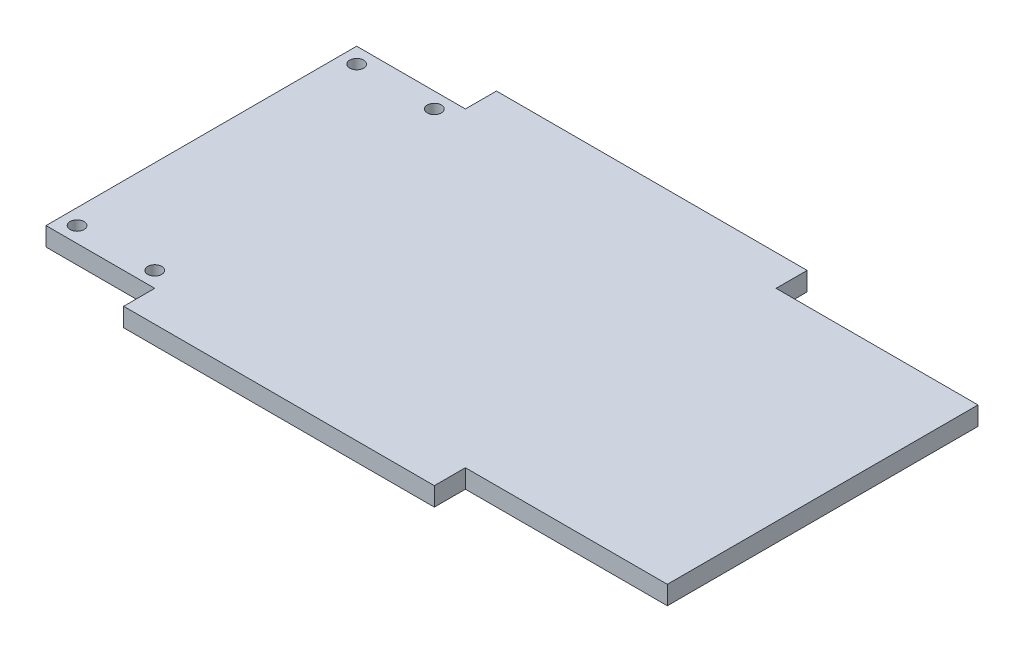
ISO-10303-21;
HEADER;
FILE_DESCRIPTION(('STEP AP214'),'2;1');
FILE_NAME('part.step','',(''),(''),'','','');
FILE_SCHEMA(('AUTOMOTIVE_DESIGN { 1 0 10303 214 1 1 1 1 }'));
ENDSEC;
DATA;
#1=APPLICATION_CONTEXT('core data for automotive mechanical design processes');
#2=APPLICATION_PROTOCOL_DEFINITION('international standard','automotive_design',2000,#1);
#3=PRODUCT_CONTEXT('',#1,'mechanical');
#4=PRODUCT('Part','Part','',(#3));
#5=PRODUCT_RELATED_PRODUCT_CATEGORY('part','',(#4));
#6=PRODUCT_DEFINITION_FORMATION('','',#4);
#7=PRODUCT_DEFINITION_CONTEXT('part definition',#1,'design');
#8=PRODUCT_DEFINITION('design','',#6,#7);
#9=PRODUCT_DEFINITION_SHAPE('','',#8);
#10=(LENGTH_UNIT() NAMED_UNIT(*) SI_UNIT(.MILLI.,.METRE.));
#11=(NAMED_UNIT(*) PLANE_ANGLE_UNIT() SI_UNIT($,.RADIAN.));
#12=(NAMED_UNIT(*) SI_UNIT($,.STERADIAN.) SOLID_ANGLE_UNIT());
#13=UNCERTAINTY_MEASURE_WITH_UNIT(LENGTH_MEASURE(1.E-05),#10,'distance_accuracy_value','');
#14=(GEOMETRIC_REPRESENTATION_CONTEXT(3) GLOBAL_UNCERTAINTY_ASSIGNED_CONTEXT((#13)) GLOBAL_UNIT_ASSIGNED_CONTEXT((#10,
#11,#12)) REPRESENTATION_CONTEXT('',''));
#15=CARTESIAN_POINT('',(0.,0.,0.));
#16=DIRECTION('',(0.,0.,1.));
#17=DIRECTION('',(1.,0.,0.));
#18=AXIS2_PLACEMENT_3D('',#15,#16,#17);
#19=CARTESIAN_POINT('',(100.,-6.,75.));
#20=DIRECTION('',(1.,0.,0.));
#21=DIRECTION('',(0.,0.,-1.));
#22=AXIS2_PLACEMENT_3D('',#19,#20,#21);
#23=PLANE('',#22);
#24=DIRECTION('',(0.,1.,0.));
#25=VECTOR('',#24,1.);
#26=CARTESIAN_POINT('',(100.,-6.,-50.));
#27=LINE('',#26,#25);
#28=CARTESIAN_POINT('',(100.,-6.,-50.));
#29=VERTEX_POINT('',#28);
#30=CARTESIAN_POINT('',(100.,0.,-50.));
#31=VERTEX_POINT('',#30);
#32=EDGE_CURVE('E195',#29,#31,#27,.T.);
#33=ORIENTED_EDGE('',*,*,#32,.T.);
#34=DIRECTION('',(0.,0.,-1.));
#35=VECTOR('',#34,1.);
#36=CARTESIAN_POINT('',(100.,0.,75.));
#37=LINE('',#36,#35);
#38=CARTESIAN_POINT('',(100.,0.,50.));
#39=VERTEX_POINT('',#38);
#40=EDGE_CURVE('E139',#39,#31,#37,.T.);
#41=ORIENTED_EDGE('',*,*,#40,.F.);
#42=DIRECTION('',(0.,1.,0.));
#43=VECTOR('',#42,1.);
#44=CARTESIAN_POINT('',(100.,-6.,50.));
#45=LINE('',#44,#43);
#46=CARTESIAN_POINT('',(100.,-6.,50.));
#47=VERTEX_POINT('',#46);
#48=EDGE_CURVE('E127',#47,#39,#45,.T.);
#49=ORIENTED_EDGE('',*,*,#48,.F.);
#50=DIRECTION('',(0.,0.,-1.));
#51=VECTOR('',#50,1.);
#52=CARTESIAN_POINT('',(100.,-6.,75.));
#53=LINE('',#52,#51);
#54=EDGE_CURVE('E25',#47,#29,#53,.T.);
#55=ORIENTED_EDGE('',*,*,#54,.T.);
#56=EDGE_LOOP('',(#33,#41,#49,#55));
#57=FACE_BOUND('',#56,.T.);
#58=ADVANCED_FACE('F17',(#57),#23,.T.);
#59=CARTESIAN_POINT('',(-100.,-6.,75.));
#60=DIRECTION('',(-1.,0.,0.));
#61=DIRECTION('',(0.,0.,1.));
#62=AXIS2_PLACEMENT_3D('',#59,#60,#61);
#63=PLANE('',#62);
#64=DIRECTION('',(0.,1.,0.));
#65=VECTOR('',#64,1.);
#66=CARTESIAN_POINT('',(-100.,-6.,50.));
#67=LINE('',#66,#65);
#68=CARTESIAN_POINT('',(-100.,-6.,50.));
#69=VERTEX_POINT('',#68);
#70=CARTESIAN_POINT('',(-100.,0.,50.));
#71=VERTEX_POINT('',#70);
#72=EDGE_CURVE('E163',#69,#71,#67,.T.);
#73=ORIENTED_EDGE('',*,*,#72,.T.);
#74=DIRECTION('',(0.,0.,1.));
#75=VECTOR('',#74,1.);
#76=CARTESIAN_POINT('',(-100.,0.,75.));
#77=LINE('',#76,#75);
#78=CARTESIAN_POINT('',(-100.,0.,-50.));
#79=VERTEX_POINT('',#78);
#80=EDGE_CURVE('E20',#79,#71,#77,.T.);
#81=ORIENTED_EDGE('',*,*,#80,.F.);
#82=DIRECTION('',(0.,1.,0.));
#83=VECTOR('',#82,1.);
#84=CARTESIAN_POINT('',(-100.,-6.,-50.));
#85=LINE('',#84,#83);
#86=CARTESIAN_POINT('',(-100.,-6.,-50.));
#87=VERTEX_POINT('',#86);
#88=EDGE_CURVE('E161',#87,#79,#85,.T.);
#89=ORIENTED_EDGE('',*,*,#88,.F.);
#90=DIRECTION('',(0.,0.,1.));
#91=VECTOR('',#90,1.);
#92=CARTESIAN_POINT('',(-100.,-6.,75.));
#93=LINE('',#92,#91);
#94=EDGE_CURVE('E11',#87,#69,#93,.T.);
#95=ORIENTED_EDGE('',*,*,#94,.T.);
#96=EDGE_LOOP('',(#73,#81,#89,#95));
#97=FACE_BOUND('',#96,.T.);
#98=ADVANCED_FACE('F160',(#97),#63,.T.);
#99=CARTESIAN_POINT('',(100.,-6.,-75.));
#100=DIRECTION('',(0.,-1.,0.));
#101=DIRECTION('',(0.,0.,-1.));
#102=AXIS2_PLACEMENT_3D('',#99,#100,#101);
#103=PLANE('',#102);
#104=DIRECTION('',(-1.,0.,0.));
#105=VECTOR('',#104,1.);
#106=CARTESIAN_POINT('',(-65.,-6.,60.));
#107=LINE('',#106,#105);
#108=CARTESIAN_POINT('',(35.,-6.,60.));
#109=VERTEX_POINT('',#108);
#110=CARTESIAN_POINT('',(-65.,-6.,60.));
#111=VERTEX_POINT('',#110);
#112=EDGE_CURVE('E105',#109,#111,#107,.T.);
#113=ORIENTED_EDGE('',*,*,#112,.T.);
#114=DIRECTION('',(0.,0.,-1.));
#115=VECTOR('',#114,1.);
#116=CARTESIAN_POINT('',(-65.,-6.,50.));
#117=LINE('',#116,#115);
#118=CARTESIAN_POINT('',(-65.,-6.,50.));
#119=VERTEX_POINT('',#118);
#120=EDGE_CURVE('E189',#111,#119,#117,.T.);
#121=ORIENTED_EDGE('',*,*,#120,.T.);
#122=DIRECTION('',(-1.,0.,0.));
#123=VECTOR('',#122,1.);
#124=CARTESIAN_POINT('',(-100.,-6.,50.));
#125=LINE('',#124,#123);
#126=EDGE_CURVE('E172',#119,#69,#125,.T.);
#127=ORIENTED_EDGE('',*,*,#126,.T.);
#128=ORIENTED_EDGE('',*,*,#94,.F.);
#129=DIRECTION('',(1.,0.,0.));
#130=VECTOR('',#129,1.);
#131=CARTESIAN_POINT('',(-100.,-6.,-50.));
#132=LINE('',#131,#130);
#133=CARTESIAN_POINT('',(-65.,-6.,-50.));
#134=VERTEX_POINT('',#133);
#135=EDGE_CURVE('E177',#87,#134,#132,.T.);
#136=ORIENTED_EDGE('',*,*,#135,.T.);
#137=DIRECTION('',(0.,0.,-1.));
#138=VECTOR('',#137,1.);
#139=CARTESIAN_POINT('',(-65.,-6.,-50.));
#140=LINE('',#139,#138);
#141=CARTESIAN_POINT('',(-65.,-6.,-60.));
#142=VERTEX_POINT('',#141);
#143=EDGE_CURVE('E180',#134,#142,#140,.T.);
#144=ORIENTED_EDGE('',*,*,#143,.T.);
#145=DIRECTION('',(1.,0.,0.));
#146=VECTOR('',#145,1.);
#147=CARTESIAN_POINT('',(-65.,-6.,-60.));
#148=LINE('',#147,#146);
#149=CARTESIAN_POINT('',(35.,-6.,-60.));
#150=VERTEX_POINT('',#149);
#151=EDGE_CURVE('E251',#142,#150,#148,.T.);
#152=ORIENTED_EDGE('',*,*,#151,.T.);
#153=DIRECTION('',(0.,0.,1.));
#154=VECTOR('',#153,1.);
#155=CARTESIAN_POINT('',(35.,-6.,-75.));
#156=LINE('',#155,#154);
#157=CARTESIAN_POINT('',(35.,-6.,-50.));
#158=VERTEX_POINT('',#157);
#159=EDGE_CURVE('E206',#150,#158,#156,.T.);
#160=ORIENTED_EDGE('',*,*,#159,.T.);
#161=DIRECTION('',(1.,0.,0.));
#162=VECTOR('',#161,1.);
#163=CARTESIAN_POINT('',(35.,-6.,-50.));
#164=LINE('',#163,#162);
#165=EDGE_CURVE('E202',#158,#29,#164,.T.);
#166=ORIENTED_EDGE('',*,*,#165,.T.);
#167=ORIENTED_EDGE('',*,*,#54,.F.);
#168=DIRECTION('',(-1.,0.,0.));
#169=VECTOR('',#168,1.);
#170=CARTESIAN_POINT('',(35.,-6.,50.));
#171=LINE('',#170,#169);
#172=CARTESIAN_POINT('',(35.,-6.,50.));
#173=VERTEX_POINT('',#172);
#174=EDGE_CURVE('E126',#47,#173,#171,.T.);
#175=ORIENTED_EDGE('',*,*,#174,.T.);
#176=DIRECTION('',(0.,0.,1.));
#177=VECTOR('',#176,1.);
#178=CARTESIAN_POINT('',(35.,-6.,75.));
#179=LINE('',#178,#177);
#180=EDGE_CURVE('E118',#173,#109,#179,.T.);
#181=ORIENTED_EDGE('',*,*,#180,.T.);
#182=EDGE_LOOP('',(#113,#121,#127,#128,#136,#144,#152,#160,#166,#167,#175,#181));
#183=FACE_BOUND('',#182,.T.);
#184=CARTESIAN_POINT('',(-70.,-6.,45.));
#185=DIRECTION('',(0.,-1.,0.));
#186=DIRECTION('',(0.,0.,-1.));
#187=AXIS2_PLACEMENT_3D('',#184,#185,#186);
#188=CIRCLE('',#187,4.48);
#189=CARTESIAN_POINT('',(-70.,-6.,40.52));
#190=VERTEX_POINT('',#189);
#191=EDGE_CURVE('E245',#190,#190,#188,.T.);
#192=ORIENTED_EDGE('',*,*,#191,.F.);
#193=EDGE_LOOP('',(#192));
#194=FACE_BOUND('',#193,.T.);
#195=CARTESIAN_POINT('',(-95.,-6.,45.));
#196=DIRECTION('',(0.,-1.,0.));
#197=DIRECTION('',(0.,0.,-1.));
#198=AXIS2_PLACEMENT_3D('',#195,#196,#197);
#199=CIRCLE('',#198,4.48);
#200=CARTESIAN_POINT('',(-95.,-6.,40.52));
#201=VERTEX_POINT('',#200);
#202=EDGE_CURVE('E236',#201,#201,#199,.T.);
#203=ORIENTED_EDGE('',*,*,#202,.F.);
#204=EDGE_LOOP('',(#203));
#205=FACE_BOUND('',#204,.T.);
#206=CARTESIAN_POINT('',(-70.,-6.,-45.));
#207=DIRECTION('',(0.,-1.,0.));
#208=DIRECTION('',(0.,0.,-1.));
#209=AXIS2_PLACEMENT_3D('',#206,#207,#208);
#210=CIRCLE('',#209,4.48);
#211=CARTESIAN_POINT('',(-70.,-6.,-49.48));
#212=VERTEX_POINT('',#211);
#213=EDGE_CURVE('E227',#212,#212,#210,.T.);
#214=ORIENTED_EDGE('',*,*,#213,.F.);
#215=EDGE_LOOP('',(#214));
#216=FACE_BOUND('',#215,.T.);
#217=CARTESIAN_POINT('',(-95.,-6.,-45.));
#218=DIRECTION('',(0.,-1.,0.));
#219=DIRECTION('',(0.,0.,-1.));
#220=AXIS2_PLACEMENT_3D('',#217,#218,#219);
#221=CIRCLE('',#220,4.48);
#222=CARTESIAN_POINT('',(-95.,-6.,-49.48));
#223=VERTEX_POINT('',#222);
#224=EDGE_CURVE('E218',#223,#223,#221,.T.);
#225=ORIENTED_EDGE('',*,*,#224,.F.);
#226=EDGE_LOOP('',(#225));
#227=FACE_BOUND('',#226,.T.);
#228=ADVANCED_FACE('F123',(#183,#194,#205,#216,#227),#103,.T.);
#229=CARTESIAN_POINT('',(100.,0.,-75.));
#230=DIRECTION('',(0.,-1.,0.));
#231=DIRECTION('',(0.,0.,-1.));
#232=AXIS2_PLACEMENT_3D('',#229,#230,#231);
#233=PLANE('',#232);
#234=CARTESIAN_POINT('',(-70.,0.,45.));
#235=DIRECTION('',(0.,-1.,0.));
#236=DIRECTION('',(0.,0.,-1.));
#237=AXIS2_PLACEMENT_3D('',#234,#235,#236);
#238=CIRCLE('',#237,2.25);
#239=CARTESIAN_POINT('',(-70.,0.,42.75));
#240=VERTEX_POINT('',#239);
#241=EDGE_CURVE('E239',#240,#240,#238,.T.);
#242=ORIENTED_EDGE('',*,*,#241,.T.);
#243=EDGE_LOOP('',(#242));
#244=FACE_BOUND('',#243,.T.);
#245=CARTESIAN_POINT('',(-95.,0.,45.));
#246=DIRECTION('',(0.,-1.,0.));
#247=DIRECTION('',(0.,0.,-1.));
#248=AXIS2_PLACEMENT_3D('',#245,#246,#247);
#249=CIRCLE('',#248,2.25);
#250=CARTESIAN_POINT('',(-95.,0.,42.75));
#251=VERTEX_POINT('',#250);
#252=EDGE_CURVE('E230',#251,#251,#249,.T.);
#253=ORIENTED_EDGE('',*,*,#252,.T.);
#254=EDGE_LOOP('',(#253));
#255=FACE_BOUND('',#254,.T.);
#256=CARTESIAN_POINT('',(-70.,0.,-45.));
#257=DIRECTION('',(0.,-1.,0.));
#258=DIRECTION('',(0.,0.,-1.));
#259=AXIS2_PLACEMENT_3D('',#256,#257,#258);
#260=CIRCLE('',#259,2.25);
#261=CARTESIAN_POINT('',(-70.,0.,-47.25));
#262=VERTEX_POINT('',#261);
#263=EDGE_CURVE('E221',#262,#262,#260,.T.);
#264=ORIENTED_EDGE('',*,*,#263,.T.);
#265=EDGE_LOOP('',(#264));
#266=FACE_BOUND('',#265,.T.);
#267=CARTESIAN_POINT('',(-95.,0.,-45.));
#268=DIRECTION('',(0.,-1.,0.));
#269=DIRECTION('',(0.,0.,-1.));
#270=AXIS2_PLACEMENT_3D('',#267,#268,#269);
#271=CIRCLE('',#270,2.25);
#272=CARTESIAN_POINT('',(-95.,0.,-47.25));
#273=VERTEX_POINT('',#272);
#274=EDGE_CURVE('E209',#273,#273,#271,.T.);
#275=ORIENTED_EDGE('',*,*,#274,.T.);
#276=EDGE_LOOP('',(#275));
#277=FACE_BOUND('',#276,.T.);
#278=DIRECTION('',(0.,0.,-1.));
#279=VECTOR('',#278,1.);
#280=CARTESIAN_POINT('',(-65.,0.,50.));
#281=LINE('',#280,#279);
#282=CARTESIAN_POINT('',(-65.,0.,60.));
#283=VERTEX_POINT('',#282);
#284=CARTESIAN_POINT('',(-65.,0.,50.));
#285=VERTEX_POINT('',#284);
#286=EDGE_CURVE('E194',#283,#285,#281,.T.);
#287=ORIENTED_EDGE('',*,*,#286,.F.);
#288=DIRECTION('',(-1.,0.,0.));
#289=VECTOR('',#288,1.);
#290=CARTESIAN_POINT('',(-65.,0.,60.));
#291=LINE('',#290,#289);
#292=CARTESIAN_POINT('',(35.,0.,60.));
#293=VERTEX_POINT('',#292);
#294=EDGE_CURVE('E33',#293,#283,#291,.T.);
#295=ORIENTED_EDGE('',*,*,#294,.F.);
#296=DIRECTION('',(0.,0.,1.));
#297=VECTOR('',#296,1.);
#298=CARTESIAN_POINT('',(35.,0.,75.));
#299=LINE('',#298,#297);
#300=CARTESIAN_POINT('',(35.,0.,50.));
#301=VERTEX_POINT('',#300);
#302=EDGE_CURVE('E121',#301,#293,#299,.T.);
#303=ORIENTED_EDGE('',*,*,#302,.F.);
#304=DIRECTION('',(-1.,0.,0.));
#305=VECTOR('',#304,1.);
#306=CARTESIAN_POINT('',(35.,0.,50.));
#307=LINE('',#306,#305);
#308=EDGE_CURVE('E134',#39,#301,#307,.T.);
#309=ORIENTED_EDGE('',*,*,#308,.F.);
#310=ORIENTED_EDGE('',*,*,#40,.T.);
#311=DIRECTION('',(1.,0.,0.));
#312=VECTOR('',#311,1.);
#313=CARTESIAN_POINT('',(35.,0.,-50.));
#314=LINE('',#313,#312);
#315=CARTESIAN_POINT('',(35.,0.,-50.));
#316=VERTEX_POINT('',#315);
#317=EDGE_CURVE('E204',#316,#31,#314,.T.);
#318=ORIENTED_EDGE('',*,*,#317,.F.);
#319=DIRECTION('',(0.,0.,1.));
#320=VECTOR('',#319,1.);
#321=CARTESIAN_POINT('',(35.,0.,-75.));
#322=LINE('',#321,#320);
#323=CARTESIAN_POINT('',(35.,0.,-60.));
#324=VERTEX_POINT('',#323);
#325=EDGE_CURVE('E207',#324,#316,#322,.T.);
#326=ORIENTED_EDGE('',*,*,#325,.F.);
#327=DIRECTION('',(1.,0.,0.));
#328=VECTOR('',#327,1.);
#329=CARTESIAN_POINT('',(-65.,0.,-60.));
#330=LINE('',#329,#328);
#331=CARTESIAN_POINT('',(-65.,0.,-60.));
#332=VERTEX_POINT('',#331);
#333=EDGE_CURVE('E41',#332,#324,#330,.T.);
#334=ORIENTED_EDGE('',*,*,#333,.F.);
#335=DIRECTION('',(0.,0.,-1.));
#336=VECTOR('',#335,1.);
#337=CARTESIAN_POINT('',(-65.,0.,-50.));
#338=LINE('',#337,#336);
#339=CARTESIAN_POINT('',(-65.,0.,-50.));
#340=VERTEX_POINT('',#339);
#341=EDGE_CURVE('E169',#340,#332,#338,.T.);
#342=ORIENTED_EDGE('',*,*,#341,.F.);
#343=DIRECTION('',(1.,0.,0.));
#344=VECTOR('',#343,1.);
#345=CARTESIAN_POINT('',(-100.,0.,-50.));
#346=LINE('',#345,#344);
#347=EDGE_CURVE('E156',#79,#340,#346,.T.);
#348=ORIENTED_EDGE('',*,*,#347,.F.);
#349=ORIENTED_EDGE('',*,*,#80,.T.);
#350=DIRECTION('',(-1.,0.,0.));
#351=VECTOR('',#350,1.);
#352=CARTESIAN_POINT('',(-100.,0.,50.));
#353=LINE('',#352,#351);
#354=EDGE_CURVE('E153',#285,#71,#353,.T.);
#355=ORIENTED_EDGE('',*,*,#354,.F.);
#356=EDGE_LOOP('',(#287,#295,#303,#309,#310,#318,#326,#334,#342,#348,#349,#355));
#357=FACE_BOUND('',#356,.T.);
#358=ADVANCED_FACE('F152',(#244,#255,#266,#277,#357),#233,.F.);
#359=CARTESIAN_POINT('',(35.,-6.,75.));
#360=DIRECTION('',(-1.,0.,0.));
#361=DIRECTION('',(0.,0.,1.));
#362=AXIS2_PLACEMENT_3D('',#359,#360,#361);
#363=PLANE('',#362);
#364=ORIENTED_EDGE('',*,*,#302,.T.);
#365=DIRECTION('',(0.,1.,0.));
#366=VECTOR('',#365,1.);
#367=CARTESIAN_POINT('',(35.,-6.,60.));
#368=LINE('',#367,#366);
#369=EDGE_CURVE('E108',#109,#293,#368,.T.);
#370=ORIENTED_EDGE('',*,*,#369,.F.);
#371=ORIENTED_EDGE('',*,*,#180,.F.);
#372=DIRECTION('',(0.,1.,0.));
#373=VECTOR('',#372,1.);
#374=CARTESIAN_POINT('',(35.,-6.,50.));
#375=LINE('',#374,#373);
#376=EDGE_CURVE('E129',#173,#301,#375,.T.);
#377=ORIENTED_EDGE('',*,*,#376,.T.);
#378=EDGE_LOOP('',(#364,#370,#371,#377));
#379=FACE_BOUND('',#378,.T.);
#380=ADVANCED_FACE('F117',(#379),#363,.F.);
#381=CARTESIAN_POINT('',(35.,-6.,50.));
#382=DIRECTION('',(0.,0.,-1.));
#383=DIRECTION('',(-1.,0.,0.));
#384=AXIS2_PLACEMENT_3D('',#381,#382,#383);
#385=PLANE('',#384);
#386=ORIENTED_EDGE('',*,*,#308,.T.);
#387=ORIENTED_EDGE('',*,*,#376,.F.);
#388=ORIENTED_EDGE('',*,*,#174,.F.);
#389=ORIENTED_EDGE('',*,*,#48,.T.);
#390=EDGE_LOOP('',(#386,#387,#388,#389));
#391=FACE_BOUND('',#390,.T.);
#392=ADVANCED_FACE('F272',(#391),#385,.F.);
#393=CARTESIAN_POINT('',(-65.,-6.,-50.));
#394=DIRECTION('',(1.,0.,0.));
#395=DIRECTION('',(0.,0.,-1.));
#396=AXIS2_PLACEMENT_3D('',#393,#394,#395);
#397=PLANE('',#396);
#398=ORIENTED_EDGE('',*,*,#341,.T.);
#399=DIRECTION('',(0.,1.,0.));
#400=VECTOR('',#399,1.);
#401=CARTESIAN_POINT('',(-65.,-6.,-60.));
#402=LINE('',#401,#400);
#403=EDGE_CURVE('E249',#142,#332,#402,.T.);
#404=ORIENTED_EDGE('',*,*,#403,.F.);
#405=ORIENTED_EDGE('',*,*,#143,.F.);
#406=DIRECTION('',(0.,1.,0.));
#407=VECTOR('',#406,1.);
#408=CARTESIAN_POINT('',(-65.,-6.,-50.));
#409=LINE('',#408,#407);
#410=EDGE_CURVE('E137',#134,#340,#409,.T.);
#411=ORIENTED_EDGE('',*,*,#410,.T.);
#412=EDGE_LOOP('',(#398,#404,#405,#411));
#413=FACE_BOUND('',#412,.T.);
#414=ADVANCED_FACE('F270',(#413),#397,.F.);
#415=CARTESIAN_POINT('',(-100.,-6.,-50.));
#416=DIRECTION('',(0.,0.,1.));
#417=DIRECTION('',(1.,0.,0.));
#418=AXIS2_PLACEMENT_3D('',#415,#416,#417);
#419=PLANE('',#418);
#420=ORIENTED_EDGE('',*,*,#347,.T.);
#421=ORIENTED_EDGE('',*,*,#410,.F.);
#422=ORIENTED_EDGE('',*,*,#135,.F.);
#423=ORIENTED_EDGE('',*,*,#88,.T.);
#424=EDGE_LOOP('',(#420,#421,#422,#423));
#425=FACE_BOUND('',#424,.T.);
#426=ADVANCED_FACE('F186',(#425),#419,.F.);
#427=CARTESIAN_POINT('',(-100.,-6.,50.));
#428=DIRECTION('',(0.,0.,-1.));
#429=DIRECTION('',(-1.,0.,0.));
#430=AXIS2_PLACEMENT_3D('',#427,#428,#429);
#431=PLANE('',#430);
#432=ORIENTED_EDGE('',*,*,#354,.T.);
#433=ORIENTED_EDGE('',*,*,#72,.F.);
#434=ORIENTED_EDGE('',*,*,#126,.F.);
#435=DIRECTION('',(0.,1.,0.));
#436=VECTOR('',#435,1.);
#437=CARTESIAN_POINT('',(-65.,-6.,50.));
#438=LINE('',#437,#436);
#439=EDGE_CURVE('E167',#119,#285,#438,.T.);
#440=ORIENTED_EDGE('',*,*,#439,.T.);
#441=EDGE_LOOP('',(#432,#433,#434,#440));
#442=FACE_BOUND('',#441,.T.);
#443=ADVANCED_FACE('F280',(#442),#431,.F.);
#444=CARTESIAN_POINT('',(-65.,-6.,50.));
#445=DIRECTION('',(1.,0.,0.));
#446=DIRECTION('',(0.,0.,-1.));
#447=AXIS2_PLACEMENT_3D('',#444,#445,#446);
#448=PLANE('',#447);
#449=ORIENTED_EDGE('',*,*,#120,.F.);
#450=DIRECTION('',(0.,1.,0.));
#451=VECTOR('',#450,1.);
#452=CARTESIAN_POINT('',(-65.,-6.,60.));
#453=LINE('',#452,#451);
#454=EDGE_CURVE('E109',#111,#283,#453,.T.);
#455=ORIENTED_EDGE('',*,*,#454,.T.);
#456=ORIENTED_EDGE('',*,*,#286,.T.);
#457=ORIENTED_EDGE('',*,*,#439,.F.);
#458=EDGE_LOOP('',(#449,#455,#456,#457));
#459=FACE_BOUND('',#458,.T.);
#460=ADVANCED_FACE('F256',(#459),#448,.F.);
#461=CARTESIAN_POINT('',(35.,-6.,-50.));
#462=DIRECTION('',(0.,0.,1.));
#463=DIRECTION('',(1.,0.,0.));
#464=AXIS2_PLACEMENT_3D('',#461,#462,#463);
#465=PLANE('',#464);
#466=ORIENTED_EDGE('',*,*,#317,.T.);
#467=ORIENTED_EDGE('',*,*,#32,.F.);
#468=ORIENTED_EDGE('',*,*,#165,.F.);
#469=DIRECTION('',(0.,1.,0.));
#470=VECTOR('',#469,1.);
#471=CARTESIAN_POINT('',(35.,-6.,-50.));
#472=LINE('',#471,#470);
#473=EDGE_CURVE('E198',#158,#316,#472,.T.);
#474=ORIENTED_EDGE('',*,*,#473,.T.);
#475=EDGE_LOOP('',(#466,#467,#468,#474));
#476=FACE_BOUND('',#475,.T.);
#477=ADVANCED_FACE('F263',(#476),#465,.F.);
#478=CARTESIAN_POINT('',(35.,-6.,-75.));
#479=DIRECTION('',(-1.,0.,0.));
#480=DIRECTION('',(0.,0.,1.));
#481=AXIS2_PLACEMENT_3D('',#478,#479,#480);
#482=PLANE('',#481);
#483=ORIENTED_EDGE('',*,*,#159,.F.);
#484=DIRECTION('',(0.,1.,0.));
#485=VECTOR('',#484,1.);
#486=CARTESIAN_POINT('',(35.,-6.,-60.));
#487=LINE('',#486,#485);
#488=EDGE_CURVE('E248',#150,#324,#487,.T.);
#489=ORIENTED_EDGE('',*,*,#488,.T.);
#490=ORIENTED_EDGE('',*,*,#325,.T.);
#491=ORIENTED_EDGE('',*,*,#473,.F.);
#492=EDGE_LOOP('',(#483,#489,#490,#491));
#493=FACE_BOUND('',#492,.T.);
#494=ADVANCED_FACE('F266',(#493),#482,.F.);
#495=CARTESIAN_POINT('',(-95.,-6.,-45.));
#496=DIRECTION('',(0.,-1.,0.));
#497=DIRECTION('',(0.,0.,-1.));
#498=AXIS2_PLACEMENT_3D('',#495,#496,#497);
#499=CYLINDRICAL_SURFACE('',#498,2.25);
#500=ORIENTED_EDGE('',*,*,#274,.F.);
#501=EDGE_LOOP('',(#500));
#502=FACE_BOUND('',#501,.T.);
#503=CARTESIAN_POINT('',(-95.,-3.77,-45.));
#504=DIRECTION('',(0.,-1.,0.));
#505=DIRECTION('',(0.,0.,-1.));
#506=AXIS2_PLACEMENT_3D('',#503,#504,#505);
#507=CIRCLE('',#506,2.25);
#508=CARTESIAN_POINT('',(-95.,-3.77,-47.25));
#509=VERTEX_POINT('',#508);
#510=EDGE_CURVE('E215',#509,#509,#507,.T.);
#511=ORIENTED_EDGE('',*,*,#510,.T.);
#512=EDGE_LOOP('',(#511));
#513=FACE_BOUND('',#512,.T.);
#514=ADVANCED_FACE('F371',(#502,#513),#499,.F.);
#515=CARTESIAN_POINT('',(-95.,-6.,-45.));
#516=DIRECTION('',(0.,-1.,0.));
#517=DIRECTION('',(0.,0.,-1.));
#518=AXIS2_PLACEMENT_3D('',#515,#516,#517);
#519=CONICAL_SURFACE('',#518,4.48,0.785398163397448);
#520=ORIENTED_EDGE('',*,*,#510,.F.);
#521=EDGE_LOOP('',(#520));
#522=FACE_BOUND('',#521,.T.);
#523=ORIENTED_EDGE('',*,*,#224,.T.);
#524=EDGE_LOOP('',(#523));
#525=FACE_BOUND('',#524,.T.);
#526=ADVANCED_FACE('F379',(#522,#525),#519,.F.);
#527=CARTESIAN_POINT('',(-70.,-6.,-45.));
#528=DIRECTION('',(0.,-1.,0.));
#529=DIRECTION('',(0.,0.,-1.));
#530=AXIS2_PLACEMENT_3D('',#527,#528,#529);
#531=CYLINDRICAL_SURFACE('',#530,2.25);
#532=ORIENTED_EDGE('',*,*,#263,.F.);
#533=EDGE_LOOP('',(#532));
#534=FACE_BOUND('',#533,.T.);
#535=CARTESIAN_POINT('',(-70.,-3.77,-45.));
#536=DIRECTION('',(0.,-1.,0.));
#537=DIRECTION('',(0.,0.,-1.));
#538=AXIS2_PLACEMENT_3D('',#535,#536,#537);
#539=CIRCLE('',#538,2.25);
#540=CARTESIAN_POINT('',(-70.,-3.77,-47.25));
#541=VERTEX_POINT('',#540);
#542=EDGE_CURVE('E224',#541,#541,#539,.T.);
#543=ORIENTED_EDGE('',*,*,#542,.T.);
#544=EDGE_LOOP('',(#543));
#545=FACE_BOUND('',#544,.T.);
#546=ADVANCED_FACE('F388',(#534,#545),#531,.F.);
#547=CARTESIAN_POINT('',(-70.,-6.,-45.));
#548=DIRECTION('',(0.,-1.,0.));
#549=DIRECTION('',(0.,0.,-1.));
#550=AXIS2_PLACEMENT_3D('',#547,#548,#549);
#551=CONICAL_SURFACE('',#550,4.48,0.785398163397448);
#552=ORIENTED_EDGE('',*,*,#542,.F.);
#553=EDGE_LOOP('',(#552));
#554=FACE_BOUND('',#553,.T.);
#555=ORIENTED_EDGE('',*,*,#213,.T.);
#556=EDGE_LOOP('',(#555));
#557=FACE_BOUND('',#556,.T.);
#558=ADVANCED_FACE('F397',(#554,#557),#551,.F.);
#559=CARTESIAN_POINT('',(-95.,-6.,45.));
#560=DIRECTION('',(0.,-1.,0.));
#561=DIRECTION('',(0.,0.,-1.));
#562=AXIS2_PLACEMENT_3D('',#559,#560,#561);
#563=CYLINDRICAL_SURFACE('',#562,2.25);
#564=ORIENTED_EDGE('',*,*,#252,.F.);
#565=EDGE_LOOP('',(#564));
#566=FACE_BOUND('',#565,.T.);
#567=CARTESIAN_POINT('',(-95.,-3.77,45.));
#568=DIRECTION('',(0.,-1.,0.));
#569=DIRECTION('',(0.,0.,-1.));
#570=AXIS2_PLACEMENT_3D('',#567,#568,#569);
#571=CIRCLE('',#570,2.25);
#572=CARTESIAN_POINT('',(-95.,-3.77,42.75));
#573=VERTEX_POINT('',#572);
#574=EDGE_CURVE('E233',#573,#573,#571,.T.);
#575=ORIENTED_EDGE('',*,*,#574,.T.);
#576=EDGE_LOOP('',(#575));
#577=FACE_BOUND('',#576,.T.);
#578=ADVANCED_FACE('F406',(#566,#577),#563,.F.);
#579=CARTESIAN_POINT('',(-95.,-6.,45.));
#580=DIRECTION('',(0.,-1.,0.));
#581=DIRECTION('',(0.,0.,-1.));
#582=AXIS2_PLACEMENT_3D('',#579,#580,#581);
#583=CONICAL_SURFACE('',#582,4.48,0.785398163397448);
#584=ORIENTED_EDGE('',*,*,#574,.F.);
#585=EDGE_LOOP('',(#584));
#586=FACE_BOUND('',#585,.T.);
#587=ORIENTED_EDGE('',*,*,#202,.T.);
#588=EDGE_LOOP('',(#587));
#589=FACE_BOUND('',#588,.T.);
#590=ADVANCED_FACE('F415',(#586,#589),#583,.F.);
#591=CARTESIAN_POINT('',(-70.,-6.,45.));
#592=DIRECTION('',(0.,-1.,0.));
#593=DIRECTION('',(0.,0.,-1.));
#594=AXIS2_PLACEMENT_3D('',#591,#592,#593);
#595=CYLINDRICAL_SURFACE('',#594,2.25);
#596=ORIENTED_EDGE('',*,*,#241,.F.);
#597=EDGE_LOOP('',(#596));
#598=FACE_BOUND('',#597,.T.);
#599=CARTESIAN_POINT('',(-70.,-3.77,45.));
#600=DIRECTION('',(0.,-1.,0.));
#601=DIRECTION('',(0.,0.,-1.));
#602=AXIS2_PLACEMENT_3D('',#599,#600,#601);
#603=CIRCLE('',#602,2.25);
#604=CARTESIAN_POINT('',(-70.,-3.77,42.75));
#605=VERTEX_POINT('',#604);
#606=EDGE_CURVE('E242',#605,#605,#603,.T.);
#607=ORIENTED_EDGE('',*,*,#606,.T.);
#608=EDGE_LOOP('',(#607));
#609=FACE_BOUND('',#608,.T.);
#610=ADVANCED_FACE('F424',(#598,#609),#595,.F.);
#611=CARTESIAN_POINT('',(-70.,-6.,45.));
#612=DIRECTION('',(0.,-1.,0.));
#613=DIRECTION('',(0.,0.,-1.));
#614=AXIS2_PLACEMENT_3D('',#611,#612,#613);
#615=CONICAL_SURFACE('',#614,4.48,0.785398163397448);
#616=ORIENTED_EDGE('',*,*,#606,.F.);
#617=EDGE_LOOP('',(#616));
#618=FACE_BOUND('',#617,.T.);
#619=ORIENTED_EDGE('',*,*,#191,.T.);
#620=EDGE_LOOP('',(#619));
#621=FACE_BOUND('',#620,.T.);
#622=ADVANCED_FACE('F433',(#618,#621),#615,.F.);
#623=CARTESIAN_POINT('',(-65.,-6.,-60.));
#624=DIRECTION('',(0.,0.,1.));
#625=DIRECTION('',(1.,0.,0.));
#626=AXIS2_PLACEMENT_3D('',#623,#624,#625);
#627=PLANE('',#626);
#628=ORIENTED_EDGE('',*,*,#333,.T.);
#629=ORIENTED_EDGE('',*,*,#488,.F.);
#630=ORIENTED_EDGE('',*,*,#151,.F.);
#631=ORIENTED_EDGE('',*,*,#403,.T.);
#632=EDGE_LOOP('',(#628,#629,#630,#631));
#633=FACE_BOUND('',#632,.T.);
#634=ADVANCED_FACE('F267',(#633),#627,.F.);
#635=CARTESIAN_POINT('',(-65.,-6.,60.));
#636=DIRECTION('',(0.,0.,-1.));
#637=DIRECTION('',(-1.,0.,0.));
#638=AXIS2_PLACEMENT_3D('',#635,#636,#637);
#639=PLANE('',#638);
#640=ORIENTED_EDGE('',*,*,#294,.T.);
#641=ORIENTED_EDGE('',*,*,#454,.F.);
#642=ORIENTED_EDGE('',*,*,#112,.F.);
#643=ORIENTED_EDGE('',*,*,#369,.T.);
#644=EDGE_LOOP('',(#640,#641,#642,#643));
#645=FACE_BOUND('',#644,.T.);
#646=ADVANCED_FACE('F107',(#645),#639,.F.);
#647=CLOSED_SHELL('',(#58,#98,#228,#358,#380,#392,#414,#426,#443,#460,#477,#494,#514,#526,#546,
#558,#578,#590,#610,#622,#634,#646));
#648=MANIFOLD_SOLID_BREP('B1',#647);
#649=ADVANCED_BREP_SHAPE_REPRESENTATION('',(#18,#648),#14);
#650=SHAPE_DEFINITION_REPRESENTATION(#9,#649);
ENDSEC;
END-ISO-10303-21;
